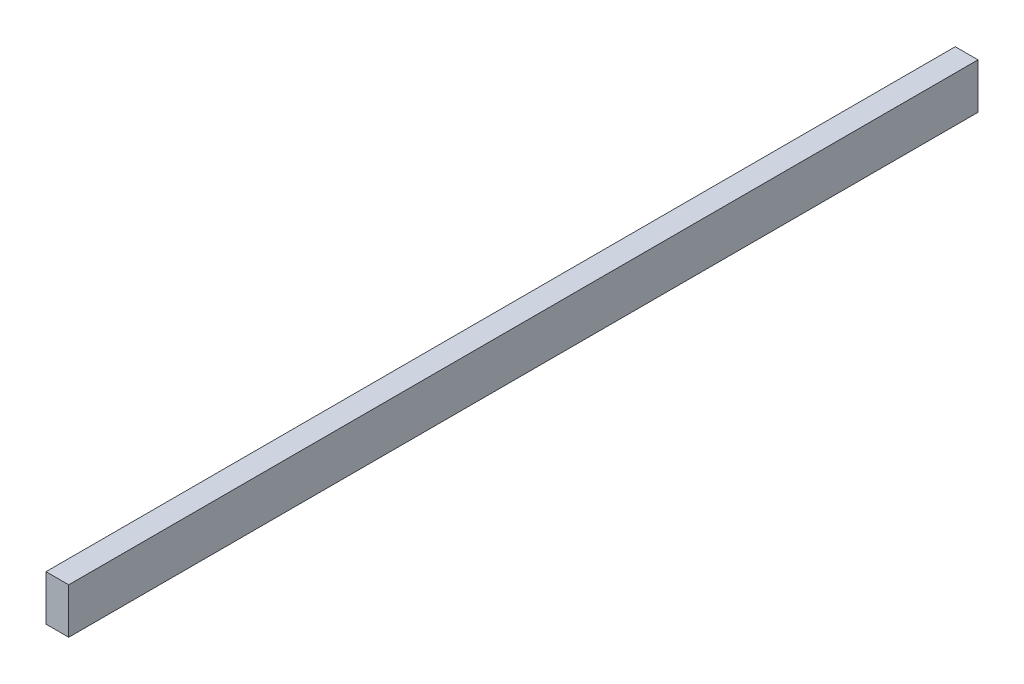
ISO-10303-21;
HEADER;
FILE_DESCRIPTION(('STEP AP214'),'2;1');
FILE_NAME('part.step','',(''),(''),'','','');
FILE_SCHEMA(('AUTOMOTIVE_DESIGN { 1 0 10303 214 1 1 1 1 }'));
ENDSEC;
DATA;
#1=APPLICATION_CONTEXT('core data for automotive mechanical design processes');
#2=APPLICATION_PROTOCOL_DEFINITION('international standard','automotive_design',2000,#1);
#3=PRODUCT_CONTEXT('',#1,'mechanical');
#4=PRODUCT('Part','Part','',(#3));
#5=PRODUCT_RELATED_PRODUCT_CATEGORY('part','',(#4));
#6=PRODUCT_DEFINITION_FORMATION('','',#4);
#7=PRODUCT_DEFINITION_CONTEXT('part definition',#1,'design');
#8=PRODUCT_DEFINITION('design','',#6,#7);
#9=PRODUCT_DEFINITION_SHAPE('','',#8);
#10=(LENGTH_UNIT() NAMED_UNIT(*) SI_UNIT(.MILLI.,.METRE.));
#11=(NAMED_UNIT(*) PLANE_ANGLE_UNIT() SI_UNIT($,.RADIAN.));
#12=(NAMED_UNIT(*) SI_UNIT($,.STERADIAN.) SOLID_ANGLE_UNIT());
#13=UNCERTAINTY_MEASURE_WITH_UNIT(LENGTH_MEASURE(1.E-05),#10,'distance_accuracy_value','');
#14=(GEOMETRIC_REPRESENTATION_CONTEXT(3) GLOBAL_UNCERTAINTY_ASSIGNED_CONTEXT((#13)) GLOBAL_UNIT_ASSIGNED_CONTEXT((#10,
#11,#12)) REPRESENTATION_CONTEXT('',''));
#15=CARTESIAN_POINT('',(0.,0.,0.));
#16=DIRECTION('',(0.,0.,1.));
#17=DIRECTION('',(1.,0.,0.));
#18=AXIS2_PLACEMENT_3D('',#15,#16,#17);
#19=CARTESIAN_POINT('',(0.,0.,2000.));
#20=DIRECTION('',(1.,0.,0.));
#21=DIRECTION('',(0.,0.,-1.));
#22=AXIS2_PLACEMENT_3D('',#19,#20,#21);
#23=PLANE('',#22);
#24=DIRECTION('',(0.,-1.,0.));
#25=VECTOR('',#24,1.);
#26=CARTESIAN_POINT('',(0.,0.,0.));
#27=LINE('',#26,#25);
#28=CARTESIAN_POINT('',(0.,100.,0.));
#29=VERTEX_POINT('',#28);
#30=CARTESIAN_POINT('',(0.,0.,0.));
#31=VERTEX_POINT('',#30);
#32=EDGE_CURVE('E96',#29,#31,#27,.T.);
#33=ORIENTED_EDGE('',*,*,#32,.T.);
#34=DIRECTION('',(0.,0.,-1.));
#35=VECTOR('',#34,1.);
#36=CARTESIAN_POINT('',(0.,0.,2000.));
#37=LINE('',#36,#35);
#38=CARTESIAN_POINT('',(0.,0.,2000.));
#39=VERTEX_POINT('',#38);
#40=EDGE_CURVE('E11',#39,#31,#37,.T.);
#41=ORIENTED_EDGE('',*,*,#40,.F.);
#42=DIRECTION('',(0.,-1.,0.));
#43=VECTOR('',#42,1.);
#44=CARTESIAN_POINT('',(0.,0.,2000.));
#45=LINE('',#44,#43);
#46=CARTESIAN_POINT('',(0.,100.,2000.));
#47=VERTEX_POINT('',#46);
#48=EDGE_CURVE('E84',#47,#39,#45,.T.);
#49=ORIENTED_EDGE('',*,*,#48,.F.);
#50=DIRECTION('',(0.,0.,-1.));
#51=VECTOR('',#50,1.);
#52=CARTESIAN_POINT('',(0.,100.,2000.));
#53=LINE('',#52,#51);
#54=EDGE_CURVE('E92',#47,#29,#53,.T.);
#55=ORIENTED_EDGE('',*,*,#54,.T.);
#56=EDGE_LOOP('',(#33,#41,#49,#55));
#57=FACE_BOUND('',#56,.T.);
#58=ADVANCED_FACE('F33',(#57),#23,.F.);
#59=CARTESIAN_POINT('',(0.,0.,2000.));
#60=DIRECTION('',(0.,1.,0.));
#61=DIRECTION('',(0.,0.,1.));
#62=AXIS2_PLACEMENT_3D('',#59,#60,#61);
#63=PLANE('',#62);
#64=DIRECTION('',(1.,0.,0.));
#65=VECTOR('',#64,1.);
#66=CARTESIAN_POINT('',(0.,0.,0.));
#67=LINE('',#66,#65);
#68=CARTESIAN_POINT('',(50.,0.,0.));
#69=VERTEX_POINT('',#68);
#70=EDGE_CURVE('E88',#31,#69,#67,.T.);
#71=ORIENTED_EDGE('',*,*,#70,.T.);
#72=DIRECTION('',(0.,0.,-1.));
#73=VECTOR('',#72,1.);
#74=CARTESIAN_POINT('',(50.,0.,2000.));
#75=LINE('',#74,#73);
#76=CARTESIAN_POINT('',(50.,0.,2000.));
#77=VERTEX_POINT('',#76);
#78=EDGE_CURVE('E41',#77,#69,#75,.T.);
#79=ORIENTED_EDGE('',*,*,#78,.F.);
#80=DIRECTION('',(1.,0.,0.));
#81=VECTOR('',#80,1.);
#82=CARTESIAN_POINT('',(0.,0.,2000.));
#83=LINE('',#82,#81);
#84=EDGE_CURVE('E79',#39,#77,#83,.T.);
#85=ORIENTED_EDGE('',*,*,#84,.F.);
#86=ORIENTED_EDGE('',*,*,#40,.T.);
#87=EDGE_LOOP('',(#71,#79,#85,#86));
#88=FACE_BOUND('',#87,.T.);
#89=ADVANCED_FACE('F87',(#88),#63,.F.);
#90=CARTESIAN_POINT('',(50.,0.,2000.));
#91=DIRECTION('',(-1.,0.,0.));
#92=DIRECTION('',(0.,0.,1.));
#93=AXIS2_PLACEMENT_3D('',#90,#91,#92);
#94=PLANE('',#93);
#95=DIRECTION('',(0.,1.,0.));
#96=VECTOR('',#95,1.);
#97=CARTESIAN_POINT('',(50.,0.,0.));
#98=LINE('',#97,#96);
#99=CARTESIAN_POINT('',(50.,100.,0.));
#100=VERTEX_POINT('',#99);
#101=EDGE_CURVE('E66',#69,#100,#98,.T.);
#102=ORIENTED_EDGE('',*,*,#101,.T.);
#103=DIRECTION('',(0.,0.,-1.));
#104=VECTOR('',#103,1.);
#105=CARTESIAN_POINT('',(50.,100.,2000.));
#106=LINE('',#105,#104);
#107=CARTESIAN_POINT('',(50.,100.,2000.));
#108=VERTEX_POINT('',#107);
#109=EDGE_CURVE('E89',#108,#100,#106,.T.);
#110=ORIENTED_EDGE('',*,*,#109,.F.);
#111=DIRECTION('',(0.,1.,0.));
#112=VECTOR('',#111,1.);
#113=CARTESIAN_POINT('',(50.,0.,2000.));
#114=LINE('',#113,#112);
#115=EDGE_CURVE('E82',#77,#108,#114,.T.);
#116=ORIENTED_EDGE('',*,*,#115,.F.);
#117=ORIENTED_EDGE('',*,*,#78,.T.);
#118=EDGE_LOOP('',(#102,#110,#116,#117));
#119=FACE_BOUND('',#118,.T.);
#120=ADVANCED_FACE('F90',(#119),#94,.F.);
#121=CARTESIAN_POINT('',(0.,100.,2000.));
#122=DIRECTION('',(0.,-1.,0.));
#123=DIRECTION('',(0.,0.,-1.));
#124=AXIS2_PLACEMENT_3D('',#121,#122,#123);
#125=PLANE('',#124);
#126=DIRECTION('',(-1.,0.,0.));
#127=VECTOR('',#126,1.);
#128=CARTESIAN_POINT('',(0.,100.,0.));
#129=LINE('',#128,#127);
#130=EDGE_CURVE('E72',#100,#29,#129,.T.);
#131=ORIENTED_EDGE('',*,*,#130,.T.);
#132=ORIENTED_EDGE('',*,*,#54,.F.);
#133=DIRECTION('',(-1.,0.,0.));
#134=VECTOR('',#133,1.);
#135=CARTESIAN_POINT('',(0.,100.,2000.));
#136=LINE('',#135,#134);
#137=EDGE_CURVE('E49',#108,#47,#136,.T.);
#138=ORIENTED_EDGE('',*,*,#137,.F.);
#139=ORIENTED_EDGE('',*,*,#109,.T.);
#140=EDGE_LOOP('',(#131,#132,#138,#139));
#141=FACE_BOUND('',#140,.T.);
#142=ADVANCED_FACE('F103',(#141),#125,.F.);
#143=CARTESIAN_POINT('',(0.,0.,2000.));
#144=DIRECTION('',(0.,0.,-1.));
#145=DIRECTION('',(-1.,0.,0.));
#146=AXIS2_PLACEMENT_3D('',#143,#144,#145);
#147=PLANE('',#146);
#148=ORIENTED_EDGE('',*,*,#48,.T.);
#149=ORIENTED_EDGE('',*,*,#84,.T.);
#150=ORIENTED_EDGE('',*,*,#115,.T.);
#151=ORIENTED_EDGE('',*,*,#137,.T.);
#152=EDGE_LOOP('',(#148,#149,#150,#151));
#153=FACE_BOUND('',#152,.T.);
#154=ADVANCED_FACE('F80',(#153),#147,.F.);
#155=CARTESIAN_POINT('',(0.,0.,0.));
#156=DIRECTION('',(0.,0.,-1.));
#157=DIRECTION('',(-1.,0.,0.));
#158=AXIS2_PLACEMENT_3D('',#155,#156,#157);
#159=PLANE('',#158);
#160=ORIENTED_EDGE('',*,*,#32,.F.);
#161=ORIENTED_EDGE('',*,*,#130,.F.);
#162=ORIENTED_EDGE('',*,*,#101,.F.);
#163=ORIENTED_EDGE('',*,*,#70,.F.);
#164=EDGE_LOOP('',(#160,#161,#162,#163));
#165=FACE_BOUND('',#164,.T.);
#166=ADVANCED_FACE('F106',(#165),#159,.T.);
#167=CLOSED_SHELL('',(#58,#89,#120,#142,#154,#166));
#168=MANIFOLD_SOLID_BREP('B2',#167);
#169=ADVANCED_BREP_SHAPE_REPRESENTATION('',(#18,#168),#14);
#170=SHAPE_DEFINITION_REPRESENTATION(#9,#169);
ENDSEC;
END-ISO-10303-21;
